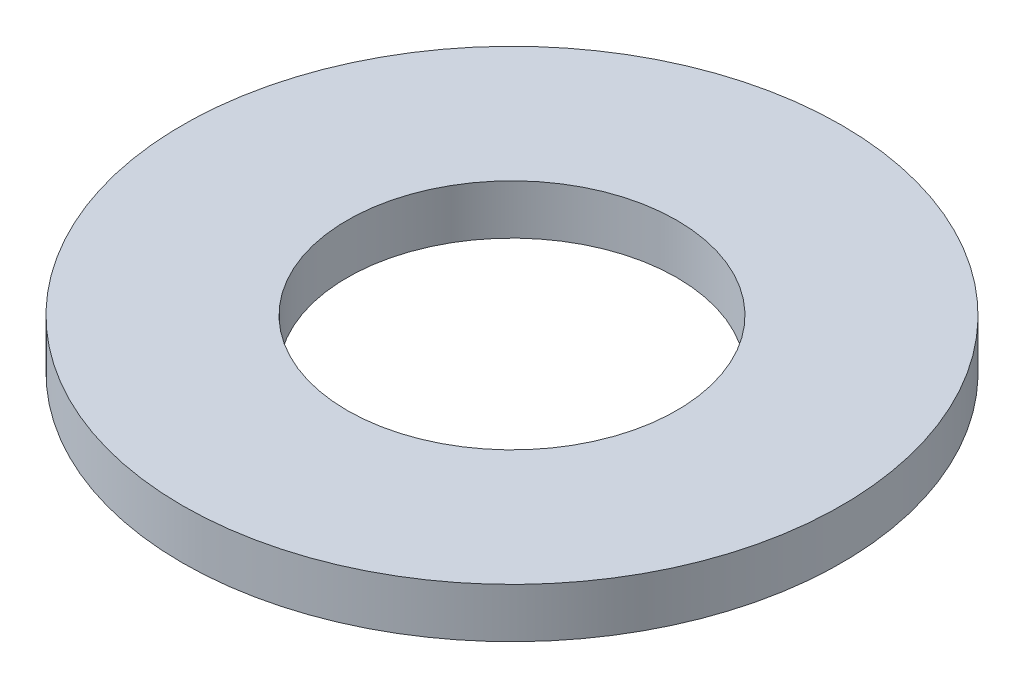
ISO-10303-21;
HEADER;
FILE_DESCRIPTION(('STEP AP214'),'2;1');
FILE_NAME('part.step','',(''),(''),'','','');
FILE_SCHEMA(('AUTOMOTIVE_DESIGN { 1 0 10303 214 1 1 1 1 }'));
ENDSEC;
DATA;
#1=APPLICATION_CONTEXT('core data for automotive mechanical design processes');
#2=APPLICATION_PROTOCOL_DEFINITION('international standard','automotive_design',2000,#1);
#3=PRODUCT_CONTEXT('',#1,'mechanical');
#4=PRODUCT('Part','Part','',(#3));
#5=PRODUCT_RELATED_PRODUCT_CATEGORY('part','',(#4));
#6=PRODUCT_DEFINITION_FORMATION('','',#4);
#7=PRODUCT_DEFINITION_CONTEXT('part definition',#1,'design');
#8=PRODUCT_DEFINITION('design','',#6,#7);
#9=PRODUCT_DEFINITION_SHAPE('','',#8);
#10=(LENGTH_UNIT() NAMED_UNIT(*) SI_UNIT(.MILLI.,.METRE.));
#11=(NAMED_UNIT(*) PLANE_ANGLE_UNIT() SI_UNIT($,.RADIAN.));
#12=(NAMED_UNIT(*) SI_UNIT($,.STERADIAN.) SOLID_ANGLE_UNIT());
#13=UNCERTAINTY_MEASURE_WITH_UNIT(LENGTH_MEASURE(1.E-05),#10,'distance_accuracy_value','');
#14=(GEOMETRIC_REPRESENTATION_CONTEXT(3) GLOBAL_UNCERTAINTY_ASSIGNED_CONTEXT((#13)) GLOBAL_UNIT_ASSIGNED_CONTEXT((#10,
#11,#12)) REPRESENTATION_CONTEXT('',''));
#15=CARTESIAN_POINT('',(0.,0.,0.));
#16=DIRECTION('',(0.,0.,1.));
#17=DIRECTION('',(1.,0.,0.));
#18=AXIS2_PLACEMENT_3D('',#15,#16,#17);
#19=CARTESIAN_POINT('',(0.,2.032,0.));
#20=DIRECTION('',(0.,-1.,0.));
#21=DIRECTION('',(0.,0.,-1.));
#22=AXIS2_PLACEMENT_3D('',#19,#20,#21);
#23=CYLINDRICAL_SURFACE('',#22,13.49375);
#24=CARTESIAN_POINT('',(0.,2.032,0.));
#25=DIRECTION('',(0.,1.,0.));
#26=DIRECTION('',(0.,0.,1.));
#27=AXIS2_PLACEMENT_3D('',#24,#25,#26);
#28=CIRCLE('',#27,13.49375);
#29=CARTESIAN_POINT('',(0.,2.032,13.49375));
#30=VERTEX_POINT('',#29);
#31=EDGE_CURVE('E10',#30,#30,#28,.T.);
#32=ORIENTED_EDGE('',*,*,#31,.F.);
#33=EDGE_LOOP('',(#32));
#34=FACE_BOUND('',#33,.T.);
#35=CARTESIAN_POINT('',(0.,0.,0.));
#36=DIRECTION('',(0.,1.,0.));
#37=DIRECTION('',(0.,0.,1.));
#38=AXIS2_PLACEMENT_3D('',#35,#36,#37);
#39=CIRCLE('',#38,13.49375);
#40=CARTESIAN_POINT('',(0.,0.,13.49375));
#41=VERTEX_POINT('',#40);
#42=EDGE_CURVE('E36',#41,#41,#39,.T.);
#43=ORIENTED_EDGE('',*,*,#42,.T.);
#44=EDGE_LOOP('',(#43));
#45=FACE_BOUND('',#44,.T.);
#46=ADVANCED_FACE('F33',(#34,#45),#23,.T.);
#47=CARTESIAN_POINT('',(0.,2.032,0.));
#48=DIRECTION('',(0.,1.,0.));
#49=DIRECTION('',(0.,0.,1.));
#50=AXIS2_PLACEMENT_3D('',#47,#48,#49);
#51=PLANE('',#50);
#52=CARTESIAN_POINT('',(0.,2.032,0.));
#53=DIRECTION('',(0.,1.,0.));
#54=DIRECTION('',(0.,0.,1.));
#55=AXIS2_PLACEMENT_3D('',#52,#53,#54);
#56=CIRCLE('',#55,6.746875);
#57=CARTESIAN_POINT('',(0.,2.032,6.746875));
#58=VERTEX_POINT('',#57);
#59=EDGE_CURVE('E45',#58,#58,#56,.T.);
#60=ORIENTED_EDGE('',*,*,#59,.F.);
#61=EDGE_LOOP('',(#60));
#62=FACE_BOUND('',#61,.T.);
#63=ORIENTED_EDGE('',*,*,#31,.T.);
#64=EDGE_LOOP('',(#63));
#65=FACE_BOUND('',#64,.T.);
#66=ADVANCED_FACE('F60',(#62,#65),#51,.T.);
#67=CARTESIAN_POINT('',(0.,0.,0.));
#68=DIRECTION('',(0.,1.,0.));
#69=DIRECTION('',(0.,0.,1.));
#70=AXIS2_PLACEMENT_3D('',#67,#68,#69);
#71=PLANE('',#70);
#72=CARTESIAN_POINT('',(0.,0.,0.));
#73=DIRECTION('',(0.,1.,0.));
#74=DIRECTION('',(0.,0.,1.));
#75=AXIS2_PLACEMENT_3D('',#72,#73,#74);
#76=CIRCLE('',#75,6.746875);
#77=CARTESIAN_POINT('',(0.,0.,6.746875));
#78=VERTEX_POINT('',#77);
#79=EDGE_CURVE('E43',#78,#78,#76,.T.);
#80=ORIENTED_EDGE('',*,*,#79,.T.);
#81=EDGE_LOOP('',(#80));
#82=FACE_BOUND('',#81,.T.);
#83=ORIENTED_EDGE('',*,*,#42,.F.);
#84=EDGE_LOOP('',(#83));
#85=FACE_BOUND('',#84,.T.);
#86=ADVANCED_FACE('F51',(#82,#85),#71,.F.);
#87=CARTESIAN_POINT('',(0.,0.,0.));
#88=DIRECTION('',(0.,1.,0.));
#89=DIRECTION('',(0.,0.,1.));
#90=AXIS2_PLACEMENT_3D('',#87,#88,#89);
#91=CYLINDRICAL_SURFACE('',#90,6.746875);
#92=ORIENTED_EDGE('',*,*,#79,.F.);
#93=EDGE_LOOP('',(#92));
#94=FACE_BOUND('',#93,.T.);
#95=ORIENTED_EDGE('',*,*,#59,.T.);
#96=EDGE_LOOP('',(#95));
#97=FACE_BOUND('',#96,.T.);
#98=ADVANCED_FACE('F54',(#94,#97),#91,.F.);
#99=CLOSED_SHELL('',(#46,#66,#86,#98));
#100=MANIFOLD_SOLID_BREP('B2',#99);
#101=ADVANCED_BREP_SHAPE_REPRESENTATION('',(#18,#100),#14);
#102=SHAPE_DEFINITION_REPRESENTATION(#9,#101);
ENDSEC;
END-ISO-10303-21;
